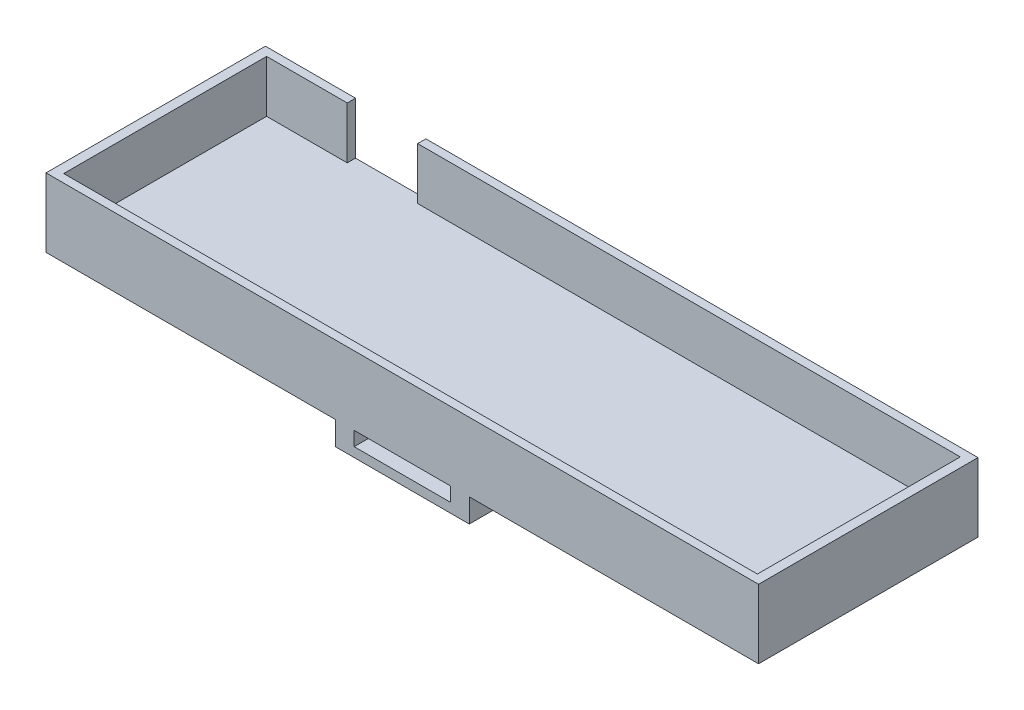
ISO-10303-21;
HEADER;
FILE_DESCRIPTION(('STEP AP214'),'2;1');
FILE_NAME('part.step','',(''),(''),'','','');
FILE_SCHEMA(('AUTOMOTIVE_DESIGN { 1 0 10303 214 1 1 1 1 }'));
ENDSEC;
DATA;
#1=APPLICATION_CONTEXT('core data for automotive mechanical design processes');
#2=APPLICATION_PROTOCOL_DEFINITION('international standard','automotive_design',2000,#1);
#3=PRODUCT_CONTEXT('',#1,'mechanical');
#4=PRODUCT('Part','Part','',(#3));
#5=PRODUCT_RELATED_PRODUCT_CATEGORY('part','',(#4));
#6=PRODUCT_DEFINITION_FORMATION('','',#4);
#7=PRODUCT_DEFINITION_CONTEXT('part definition',#1,'design');
#8=PRODUCT_DEFINITION('design','',#6,#7);
#9=PRODUCT_DEFINITION_SHAPE('','',#8);
#10=(LENGTH_UNIT() NAMED_UNIT(*) SI_UNIT(.MILLI.,.METRE.));
#11=(NAMED_UNIT(*) PLANE_ANGLE_UNIT() SI_UNIT($,.RADIAN.));
#12=(NAMED_UNIT(*) SI_UNIT($,.STERADIAN.) SOLID_ANGLE_UNIT());
#13=UNCERTAINTY_MEASURE_WITH_UNIT(LENGTH_MEASURE(1.E-05),#10,'distance_accuracy_value','');
#14=(GEOMETRIC_REPRESENTATION_CONTEXT(3) GLOBAL_UNCERTAINTY_ASSIGNED_CONTEXT((#13)) GLOBAL_UNIT_ASSIGNED_CONTEXT((#10,
#11,#12)) REPRESENTATION_CONTEXT('',''));
#15=CARTESIAN_POINT('',(0.,0.,0.));
#16=DIRECTION('',(0.,0.,1.));
#17=DIRECTION('',(1.,0.,0.));
#18=AXIS2_PLACEMENT_3D('',#15,#16,#17);
#19=CARTESIAN_POINT('',(-73.5,3.6,-21.5));
#20=DIRECTION('',(0.,0.,-1.));
#21=DIRECTION('',(-1.,0.,0.));
#22=AXIS2_PLACEMENT_3D('',#19,#20,#21);
#23=PLANE('',#22);
#24=DIRECTION('',(-1.,0.,0.));
#25=VECTOR('',#24,1.);
#26=CARTESIAN_POINT('',(-73.5,14.6,-21.5));
#27=LINE('',#26,#25);
#28=CARTESIAN_POINT('',(73.5,14.6,-21.5));
#29=VERTEX_POINT('',#28);
#30=CARTESIAN_POINT('',(-41.5,14.6,-21.5));
#31=VERTEX_POINT('',#30);
#32=EDGE_CURVE('E302',#29,#31,#27,.T.);
#33=ORIENTED_EDGE('',*,*,#32,.T.);
#34=DIRECTION('',(0.,1.,0.));
#35=VECTOR('',#34,1.);
#36=CARTESIAN_POINT('',(-41.5,3.6,-21.5));
#37=LINE('',#36,#35);
#38=CARTESIAN_POINT('',(-41.5,3.6,-21.5));
#39=VERTEX_POINT('',#38);
#40=EDGE_CURVE('E276',#39,#31,#37,.T.);
#41=ORIENTED_EDGE('',*,*,#40,.F.);
#42=DIRECTION('',(-1.,0.,0.));
#43=VECTOR('',#42,1.);
#44=CARTESIAN_POINT('',(-73.5,3.6,-21.5));
#45=LINE('',#44,#43);
#46=CARTESIAN_POINT('',(73.5,3.6,-21.5));
#47=VERTEX_POINT('',#46);
#48=EDGE_CURVE('E290',#47,#39,#45,.T.);
#49=ORIENTED_EDGE('',*,*,#48,.F.);
#50=DIRECTION('',(0.,1.,0.));
#51=VECTOR('',#50,1.);
#52=CARTESIAN_POINT('',(73.5,3.6,-21.5));
#53=LINE('',#52,#51);
#54=EDGE_CURVE('E299',#47,#29,#53,.T.);
#55=ORIENTED_EDGE('',*,*,#54,.T.);
#56=EDGE_LOOP('',(#33,#41,#49,#55));
#57=FACE_BOUND('',#56,.T.);
#58=ADVANCED_FACE('F35',(#57),#23,.F.);
#59=CARTESIAN_POINT('',(0.,0.,0.));
#60=DIRECTION('',(0.,1.,0.));
#61=DIRECTION('',(0.,0.,1.));
#62=AXIS2_PLACEMENT_3D('',#59,#60,#61);
#63=PLANE('',#62);
#64=DIRECTION('',(0.,0.,1.));
#65=VECTOR('',#64,1.);
#66=CARTESIAN_POINT('',(-10.2,0.,-23.25));
#67=LINE('',#66,#65);
#68=CARTESIAN_POINT('',(-10.2,0.,-23.25));
#69=VERTEX_POINT('',#68);
#70=CARTESIAN_POINT('',(-10.2,0.,-10.));
#71=VERTEX_POINT('',#70);
#72=EDGE_CURVE('E312',#69,#71,#67,.T.);
#73=ORIENTED_EDGE('',*,*,#72,.F.);
#74=DIRECTION('',(-1.,0.,0.));
#75=VECTOR('',#74,1.);
#76=CARTESIAN_POINT('',(-75.5,0.,-23.25));
#77=LINE('',#76,#75);
#78=CARTESIAN_POINT('',(10.2,0.,-23.25));
#79=VERTEX_POINT('',#78);
#80=EDGE_CURVE('E426',#79,#69,#77,.T.);
#81=ORIENTED_EDGE('',*,*,#80,.F.);
#82=DIRECTION('',(0.,0.,-1.));
#83=VECTOR('',#82,1.);
#84=CARTESIAN_POINT('',(10.2,0.,-23.25));
#85=LINE('',#84,#83);
#86=CARTESIAN_POINT('',(10.2,0.,-9.99999999999999));
#87=VERTEX_POINT('',#86);
#88=EDGE_CURVE('E346',#87,#79,#85,.T.);
#89=ORIENTED_EDGE('',*,*,#88,.F.);
#90=DIRECTION('',(-1.,0.,0.));
#91=VECTOR('',#90,1.);
#92=CARTESIAN_POINT('',(10.2,0.,-9.99999999999999));
#93=LINE('',#92,#91);
#94=CARTESIAN_POINT('',(14.2,0.,-9.99999999999999));
#95=VERTEX_POINT('',#94);
#96=EDGE_CURVE('E351',#95,#87,#93,.T.);
#97=ORIENTED_EDGE('',*,*,#96,.F.);
#98=DIRECTION('',(0.,0.,1.));
#99=VECTOR('',#98,1.);
#100=CARTESIAN_POINT('',(14.2,0.,-23.25));
#101=LINE('',#100,#99);
#102=CARTESIAN_POINT('',(14.2,0.,-23.25));
#103=VERTEX_POINT('',#102);
#104=EDGE_CURVE('E341',#103,#95,#101,.T.);
#105=ORIENTED_EDGE('',*,*,#104,.F.);
#106=CARTESIAN_POINT('',(75.5,0.,-23.25));
#107=VERTEX_POINT('',#106);
#108=EDGE_CURVE('E422',#107,#103,#77,.T.);
#109=ORIENTED_EDGE('',*,*,#108,.F.);
#110=DIRECTION('',(0.,0.,-1.));
#111=VECTOR('',#110,1.);
#112=CARTESIAN_POINT('',(75.5,0.,-23.25));
#113=LINE('',#112,#111);
#114=CARTESIAN_POINT('',(75.5,0.,23.25));
#115=VERTEX_POINT('',#114);
#116=EDGE_CURVE('E405',#115,#107,#113,.T.);
#117=ORIENTED_EDGE('',*,*,#116,.F.);
#118=DIRECTION('',(1.,0.,0.));
#119=VECTOR('',#118,1.);
#120=CARTESIAN_POINT('',(-75.5,0.,23.25));
#121=LINE('',#120,#119);
#122=CARTESIAN_POINT('',(14.2,0.,23.25));
#123=VERTEX_POINT('',#122);
#124=EDGE_CURVE('E428',#123,#115,#121,.T.);
#125=ORIENTED_EDGE('',*,*,#124,.F.);
#126=DIRECTION('',(0.,0.,1.));
#127=VECTOR('',#126,1.);
#128=CARTESIAN_POINT('',(14.2,0.,23.25));
#129=LINE('',#128,#127);
#130=CARTESIAN_POINT('',(14.2,0.,9.99999999999999));
#131=VERTEX_POINT('',#130);
#132=EDGE_CURVE('E227',#131,#123,#129,.T.);
#133=ORIENTED_EDGE('',*,*,#132,.F.);
#134=DIRECTION('',(1.,0.,0.));
#135=VECTOR('',#134,1.);
#136=CARTESIAN_POINT('',(10.2,0.,9.99999999999999));
#137=LINE('',#136,#135);
#138=CARTESIAN_POINT('',(10.2,0.,9.99999999999999));
#139=VERTEX_POINT('',#138);
#140=EDGE_CURVE('E373',#139,#131,#137,.T.);
#141=ORIENTED_EDGE('',*,*,#140,.F.);
#142=DIRECTION('',(0.,0.,-1.));
#143=VECTOR('',#142,1.);
#144=CARTESIAN_POINT('',(10.2,0.,23.25));
#145=LINE('',#144,#143);
#146=CARTESIAN_POINT('',(10.2,0.,23.25));
#147=VERTEX_POINT('',#146);
#148=EDGE_CURVE('E364',#147,#139,#145,.T.);
#149=ORIENTED_EDGE('',*,*,#148,.F.);
#150=CARTESIAN_POINT('',(-10.2,0.,23.25));
#151=VERTEX_POINT('',#150);
#152=EDGE_CURVE('E430',#151,#147,#121,.T.);
#153=ORIENTED_EDGE('',*,*,#152,.F.);
#154=DIRECTION('',(0.,0.,1.));
#155=VECTOR('',#154,1.);
#156=CARTESIAN_POINT('',(-10.2,0.,23.25));
#157=LINE('',#156,#155);
#158=CARTESIAN_POINT('',(-10.2,0.,9.99999999999999));
#159=VERTEX_POINT('',#158);
#160=EDGE_CURVE('E385',#159,#151,#157,.T.);
#161=ORIENTED_EDGE('',*,*,#160,.F.);
#162=DIRECTION('',(1.,0.,0.));
#163=VECTOR('',#162,1.);
#164=CARTESIAN_POINT('',(-10.2,0.,9.99999999999999));
#165=LINE('',#164,#163);
#166=CARTESIAN_POINT('',(-14.2,0.,9.99999999999999));
#167=VERTEX_POINT('',#166);
#168=EDGE_CURVE('E390',#167,#159,#165,.T.);
#169=ORIENTED_EDGE('',*,*,#168,.F.);
#170=DIRECTION('',(0.,0.,-1.));
#171=VECTOR('',#170,1.);
#172=CARTESIAN_POINT('',(-14.2,0.,23.25));
#173=LINE('',#172,#171);
#174=CARTESIAN_POINT('',(-14.2,0.,23.25));
#175=VERTEX_POINT('',#174);
#176=EDGE_CURVE('E380',#175,#167,#173,.T.);
#177=ORIENTED_EDGE('',*,*,#176,.F.);
#178=CARTESIAN_POINT('',(-75.5,0.,23.25));
#179=VERTEX_POINT('',#178);
#180=EDGE_CURVE('E410',#179,#175,#121,.T.);
#181=ORIENTED_EDGE('',*,*,#180,.F.);
#182=DIRECTION('',(0.,0.,1.));
#183=VECTOR('',#182,1.);
#184=CARTESIAN_POINT('',(-75.5,0.,-23.25));
#185=LINE('',#184,#183);
#186=CARTESIAN_POINT('',(-75.5,0.,-23.25));
#187=VERTEX_POINT('',#186);
#188=EDGE_CURVE('E425',#187,#179,#185,.T.);
#189=ORIENTED_EDGE('',*,*,#188,.F.);
#190=CARTESIAN_POINT('',(-14.2,0.,-23.25));
#191=VERTEX_POINT('',#190);
#192=EDGE_CURVE('E421',#191,#187,#77,.T.);
#193=ORIENTED_EDGE('',*,*,#192,.F.);
#194=DIRECTION('',(0.,0.,-1.));
#195=VECTOR('',#194,1.);
#196=CARTESIAN_POINT('',(-14.2,0.,-23.25));
#197=LINE('',#196,#195);
#198=CARTESIAN_POINT('',(-14.2,0.,-10.));
#199=VERTEX_POINT('',#198);
#200=EDGE_CURVE('E323',#199,#191,#197,.T.);
#201=ORIENTED_EDGE('',*,*,#200,.F.);
#202=DIRECTION('',(-1.,0.,0.));
#203=VECTOR('',#202,1.);
#204=CARTESIAN_POINT('',(-10.2,0.,-10.));
#205=LINE('',#204,#203);
#206=EDGE_CURVE('E329',#71,#199,#205,.T.);
#207=ORIENTED_EDGE('',*,*,#206,.F.);
#208=EDGE_LOOP('',(#73,#81,#89,#97,#105,#109,#117,#125,#133,#141,#149,#153,#161,#169,#177,#181,
#189,#193,#201,#207));
#209=FACE_BOUND('',#208,.T.);
#210=ADVANCED_FACE('F448',(#209),#63,.F.);
#211=CARTESIAN_POINT('',(75.5,14.6,-23.25));
#212=DIRECTION('',(-1.,0.,0.));
#213=DIRECTION('',(0.,0.,1.));
#214=AXIS2_PLACEMENT_3D('',#211,#212,#213);
#215=PLANE('',#214);
#216=ORIENTED_EDGE('',*,*,#116,.T.);
#217=DIRECTION('',(0.,-1.,0.));
#218=VECTOR('',#217,1.);
#219=CARTESIAN_POINT('',(75.5,14.6,-23.25));
#220=LINE('',#219,#218);
#221=CARTESIAN_POINT('',(75.5,14.6,-23.25));
#222=VERTEX_POINT('',#221);
#223=EDGE_CURVE('E11',#222,#107,#220,.T.);
#224=ORIENTED_EDGE('',*,*,#223,.F.);
#225=DIRECTION('',(0.,0.,-1.));
#226=VECTOR('',#225,1.);
#227=CARTESIAN_POINT('',(75.5,14.6,-23.25));
#228=LINE('',#227,#226);
#229=CARTESIAN_POINT('',(75.5,14.6,23.25));
#230=VERTEX_POINT('',#229);
#231=EDGE_CURVE('E406',#230,#222,#228,.T.);
#232=ORIENTED_EDGE('',*,*,#231,.F.);
#233=DIRECTION('',(0.,-1.,0.));
#234=VECTOR('',#233,1.);
#235=CARTESIAN_POINT('',(75.5,14.6,23.25));
#236=LINE('',#235,#234);
#237=EDGE_CURVE('E418',#230,#115,#236,.T.);
#238=ORIENTED_EDGE('',*,*,#237,.T.);
#239=EDGE_LOOP('',(#216,#224,#232,#238));
#240=FACE_BOUND('',#239,.T.);
#241=ADVANCED_FACE('F37',(#240),#215,.F.);
#242=CARTESIAN_POINT('',(-75.5,14.6,-23.25));
#243=DIRECTION('',(0.,0.,1.));
#244=DIRECTION('',(1.,0.,0.));
#245=AXIS2_PLACEMENT_3D('',#242,#243,#244);
#246=PLANE('',#245);
#247=DIRECTION('',(0.,1.,0.));
#248=VECTOR('',#247,1.);
#249=CARTESIAN_POINT('',(14.2,-3.,-23.25));
#250=LINE('',#249,#248);
#251=CARTESIAN_POINT('',(14.2,-5.,-23.25));
#252=VERTEX_POINT('',#251);
#253=EDGE_CURVE('E362',#252,#103,#250,.T.);
#254=ORIENTED_EDGE('',*,*,#253,.F.);
#255=DIRECTION('',(1.,0.,0.));
#256=VECTOR('',#255,1.);
#257=CARTESIAN_POINT('',(14.2,-5.,-23.25));
#258=LINE('',#257,#256);
#259=CARTESIAN_POINT('',(-14.2,-5.,-23.25));
#260=VERTEX_POINT('',#259);
#261=EDGE_CURVE('E248',#260,#252,#258,.T.);
#262=ORIENTED_EDGE('',*,*,#261,.F.);
#263=DIRECTION('',(0.,1.,0.));
#264=VECTOR('',#263,1.);
#265=CARTESIAN_POINT('',(-14.2,-3.,-23.25));
#266=LINE('',#265,#264);
#267=EDGE_CURVE('E334',#260,#191,#266,.T.);
#268=ORIENTED_EDGE('',*,*,#267,.T.);
#269=ORIENTED_EDGE('',*,*,#192,.T.);
#270=DIRECTION('',(0.,-1.,0.));
#271=VECTOR('',#270,1.);
#272=CARTESIAN_POINT('',(-75.5,14.6,-23.25));
#273=LINE('',#272,#271);
#274=CARTESIAN_POINT('',(-75.5,14.6,-23.25));
#275=VERTEX_POINT('',#274);
#276=EDGE_CURVE('E43',#275,#187,#273,.T.);
#277=ORIENTED_EDGE('',*,*,#276,.F.);
#278=DIRECTION('',(-1.,0.,0.));
#279=VECTOR('',#278,1.);
#280=CARTESIAN_POINT('',(-75.5,14.6,-23.25));
#281=LINE('',#280,#279);
#282=CARTESIAN_POINT('',(-56.4143130677962,14.6,-23.25));
#283=VERTEX_POINT('',#282);
#284=EDGE_CURVE('E409',#283,#275,#281,.T.);
#285=ORIENTED_EDGE('',*,*,#284,.F.);
#286=DIRECTION('',(0.,1.,0.));
#287=VECTOR('',#286,1.);
#288=CARTESIAN_POINT('',(-56.4143130677962,3.6,-23.25));
#289=LINE('',#288,#287);
#290=CARTESIAN_POINT('',(-56.4143130677962,3.6,-23.25));
#291=VERTEX_POINT('',#290);
#292=EDGE_CURVE('E281',#291,#283,#289,.T.);
#293=ORIENTED_EDGE('',*,*,#292,.F.);
#294=DIRECTION('',(-1.,0.,0.));
#295=VECTOR('',#294,1.);
#296=CARTESIAN_POINT('',(-41.5,3.6,-23.25));
#297=LINE('',#296,#295);
#298=CARTESIAN_POINT('',(-41.5,3.6,-23.25));
#299=VERTEX_POINT('',#298);
#300=EDGE_CURVE('E269',#299,#291,#297,.T.);
#301=ORIENTED_EDGE('',*,*,#300,.F.);
#302=DIRECTION('',(0.,1.,0.));
#303=VECTOR('',#302,1.);
#304=CARTESIAN_POINT('',(-41.5,3.6,-23.25));
#305=LINE('',#304,#303);
#306=CARTESIAN_POINT('',(-41.5,14.6,-23.25));
#307=VERTEX_POINT('',#306);
#308=EDGE_CURVE('E273',#299,#307,#305,.T.);
#309=ORIENTED_EDGE('',*,*,#308,.T.);
#310=EDGE_CURVE('E411',#222,#307,#281,.T.);
#311=ORIENTED_EDGE('',*,*,#310,.F.);
#312=ORIENTED_EDGE('',*,*,#223,.T.);
#313=ORIENTED_EDGE('',*,*,#108,.T.);
#314=EDGE_LOOP('',(#254,#262,#268,#269,#277,#285,#293,#301,#309,#311,#312,#313));
#315=FACE_BOUND('',#314,.T.);
#316=DIRECTION('',(1.,0.,0.));
#317=VECTOR('',#316,1.);
#318=CARTESIAN_POINT('',(14.2,-3.,-23.25));
#319=LINE('',#318,#317);
#320=CARTESIAN_POINT('',(-10.2,-3.,-23.25));
#321=VERTEX_POINT('',#320);
#322=CARTESIAN_POINT('',(10.2,-3.,-23.25));
#323=VERTEX_POINT('',#322);
#324=EDGE_CURVE('E249',#321,#323,#319,.T.);
#325=ORIENTED_EDGE('',*,*,#324,.T.);
#326=DIRECTION('',(0.,1.,0.));
#327=VECTOR('',#326,1.);
#328=CARTESIAN_POINT('',(10.2,-3.,-23.25));
#329=LINE('',#328,#327);
#330=EDGE_CURVE('E349',#323,#79,#329,.T.);
#331=ORIENTED_EDGE('',*,*,#330,.T.);
#332=ORIENTED_EDGE('',*,*,#80,.T.);
#333=DIRECTION('',(0.,1.,0.));
#334=VECTOR('',#333,1.);
#335=CARTESIAN_POINT('',(-10.2,-3.,-23.25));
#336=LINE('',#335,#334);
#337=EDGE_CURVE('E326',#321,#69,#336,.T.);
#338=ORIENTED_EDGE('',*,*,#337,.F.);
#339=EDGE_LOOP('',(#325,#331,#332,#338));
#340=FACE_BOUND('',#339,.T.);
#341=ADVANCED_FACE('F453',(#315,#340),#246,.F.);
#342=CARTESIAN_POINT('',(-75.5,14.6,-23.25));
#343=DIRECTION('',(1.,0.,0.));
#344=DIRECTION('',(0.,0.,-1.));
#345=AXIS2_PLACEMENT_3D('',#342,#343,#344);
#346=PLANE('',#345);
#347=ORIENTED_EDGE('',*,*,#188,.T.);
#348=DIRECTION('',(0.,-1.,0.));
#349=VECTOR('',#348,1.);
#350=CARTESIAN_POINT('',(-75.5,14.6,23.25));
#351=LINE('',#350,#349);
#352=CARTESIAN_POINT('',(-75.5,14.6,23.25));
#353=VERTEX_POINT('',#352);
#354=EDGE_CURVE('E433',#353,#179,#351,.T.);
#355=ORIENTED_EDGE('',*,*,#354,.F.);
#356=DIRECTION('',(0.,0.,1.));
#357=VECTOR('',#356,1.);
#358=CARTESIAN_POINT('',(-75.5,14.6,-23.25));
#359=LINE('',#358,#357);
#360=EDGE_CURVE('E414',#275,#353,#359,.T.);
#361=ORIENTED_EDGE('',*,*,#360,.F.);
#362=ORIENTED_EDGE('',*,*,#276,.T.);
#363=EDGE_LOOP('',(#347,#355,#361,#362));
#364=FACE_BOUND('',#363,.T.);
#365=ADVANCED_FACE('F440',(#364),#346,.F.);
#366=CARTESIAN_POINT('',(-75.5,14.6,23.25));
#367=DIRECTION('',(0.,0.,-1.));
#368=DIRECTION('',(-1.,0.,0.));
#369=AXIS2_PLACEMENT_3D('',#366,#367,#368);
#370=PLANE('',#369);
#371=DIRECTION('',(0.,1.,0.));
#372=VECTOR('',#371,1.);
#373=CARTESIAN_POINT('',(-14.2,-3.,23.25));
#374=LINE('',#373,#372);
#375=CARTESIAN_POINT('',(-14.2,-5.,23.25));
#376=VERTEX_POINT('',#375);
#377=EDGE_CURVE('E239',#376,#175,#374,.T.);
#378=ORIENTED_EDGE('',*,*,#377,.F.);
#379=DIRECTION('',(-1.,0.,0.));
#380=VECTOR('',#379,1.);
#381=CARTESIAN_POINT('',(14.2,-5.,23.25));
#382=LINE('',#381,#380);
#383=CARTESIAN_POINT('',(14.2,-5.,23.25));
#384=VERTEX_POINT('',#383);
#385=EDGE_CURVE('E234',#384,#376,#382,.T.);
#386=ORIENTED_EDGE('',*,*,#385,.F.);
#387=DIRECTION('',(0.,1.,0.));
#388=VECTOR('',#387,1.);
#389=CARTESIAN_POINT('',(14.2,-3.,23.25));
#390=LINE('',#389,#388);
#391=EDGE_CURVE('E220',#384,#123,#390,.T.);
#392=ORIENTED_EDGE('',*,*,#391,.T.);
#393=ORIENTED_EDGE('',*,*,#124,.T.);
#394=ORIENTED_EDGE('',*,*,#237,.F.);
#395=DIRECTION('',(1.,0.,0.));
#396=VECTOR('',#395,1.);
#397=CARTESIAN_POINT('',(-75.5,14.6,23.25));
#398=LINE('',#397,#396);
#399=EDGE_CURVE('E416',#353,#230,#398,.T.);
#400=ORIENTED_EDGE('',*,*,#399,.F.);
#401=ORIENTED_EDGE('',*,*,#354,.T.);
#402=ORIENTED_EDGE('',*,*,#180,.T.);
#403=EDGE_LOOP('',(#378,#386,#392,#393,#394,#400,#401,#402));
#404=FACE_BOUND('',#403,.T.);
#405=DIRECTION('',(-1.,0.,0.));
#406=VECTOR('',#405,1.);
#407=CARTESIAN_POINT('',(14.2,-3.,23.25));
#408=LINE('',#407,#406);
#409=CARTESIAN_POINT('',(10.2,-3.,23.25));
#410=VERTEX_POINT('',#409);
#411=CARTESIAN_POINT('',(-10.2,-3.,23.25));
#412=VERTEX_POINT('',#411);
#413=EDGE_CURVE('E261',#410,#412,#408,.T.);
#414=ORIENTED_EDGE('',*,*,#413,.T.);
#415=DIRECTION('',(0.,1.,0.));
#416=VECTOR('',#415,1.);
#417=CARTESIAN_POINT('',(-10.2,-3.,23.25));
#418=LINE('',#417,#416);
#419=EDGE_CURVE('E396',#412,#151,#418,.T.);
#420=ORIENTED_EDGE('',*,*,#419,.T.);
#421=ORIENTED_EDGE('',*,*,#152,.T.);
#422=DIRECTION('',(0.,1.,0.));
#423=VECTOR('',#422,1.);
#424=CARTESIAN_POINT('',(10.2,-3.,23.25));
#425=LINE('',#424,#423);
#426=EDGE_CURVE('E231',#410,#147,#425,.T.);
#427=ORIENTED_EDGE('',*,*,#426,.F.);
#428=EDGE_LOOP('',(#414,#420,#421,#427));
#429=FACE_BOUND('',#428,.T.);
#430=ADVANCED_FACE('F235',(#404,#429),#370,.F.);
#431=CARTESIAN_POINT('',(0.,14.6,0.));
#432=DIRECTION('',(0.,1.,0.));
#433=DIRECTION('',(0.,0.,1.));
#434=AXIS2_PLACEMENT_3D('',#431,#432,#433);
#435=PLANE('',#434);
#436=DIRECTION('',(0.,0.,-1.));
#437=VECTOR('',#436,1.);
#438=CARTESIAN_POINT('',(-41.5,14.6,-23.25));
#439=LINE('',#438,#437);
#440=EDGE_CURVE('E257',#31,#307,#439,.T.);
#441=ORIENTED_EDGE('',*,*,#440,.F.);
#442=ORIENTED_EDGE('',*,*,#32,.F.);
#443=DIRECTION('',(0.,0.,-1.));
#444=VECTOR('',#443,1.);
#445=CARTESIAN_POINT('',(73.5,14.6,21.5));
#446=LINE('',#445,#444);
#447=CARTESIAN_POINT('',(73.5,14.6,21.5));
#448=VERTEX_POINT('',#447);
#449=EDGE_CURVE('E58',#448,#29,#446,.T.);
#450=ORIENTED_EDGE('',*,*,#449,.F.);
#451=DIRECTION('',(1.,0.,0.));
#452=VECTOR('',#451,1.);
#453=CARTESIAN_POINT('',(-73.5,14.6,21.5));
#454=LINE('',#453,#452);
#455=CARTESIAN_POINT('',(-73.5,14.6,21.5));
#456=VERTEX_POINT('',#455);
#457=EDGE_CURVE('E289',#456,#448,#454,.T.);
#458=ORIENTED_EDGE('',*,*,#457,.F.);
#459=DIRECTION('',(0.,0.,1.));
#460=VECTOR('',#459,1.);
#461=CARTESIAN_POINT('',(-73.5,14.6,21.5));
#462=LINE('',#461,#460);
#463=CARTESIAN_POINT('',(-73.5,14.6,-21.5));
#464=VERTEX_POINT('',#463);
#465=EDGE_CURVE('E305',#464,#456,#462,.T.);
#466=ORIENTED_EDGE('',*,*,#465,.F.);
#467=CARTESIAN_POINT('',(-56.4143130677962,14.6,-21.5));
#468=VERTEX_POINT('',#467);
#469=EDGE_CURVE('E301',#468,#464,#27,.T.);
#470=ORIENTED_EDGE('',*,*,#469,.F.);
#471=DIRECTION('',(0.,0.,1.));
#472=VECTOR('',#471,1.);
#473=CARTESIAN_POINT('',(-56.4143130677962,14.6,-23.25));
#474=LINE('',#473,#472);
#475=EDGE_CURVE('E270',#283,#468,#474,.T.);
#476=ORIENTED_EDGE('',*,*,#475,.F.);
#477=ORIENTED_EDGE('',*,*,#284,.T.);
#478=ORIENTED_EDGE('',*,*,#360,.T.);
#479=ORIENTED_EDGE('',*,*,#399,.T.);
#480=ORIENTED_EDGE('',*,*,#231,.T.);
#481=ORIENTED_EDGE('',*,*,#310,.T.);
#482=EDGE_LOOP('',(#441,#442,#450,#458,#466,#470,#476,#477,#478,#479,#480,#481));
#483=FACE_BOUND('',#482,.T.);
#484=ADVANCED_FACE('F537',(#483),#435,.T.);
#485=CARTESIAN_POINT('',(-14.2,-3.,23.25));
#486=DIRECTION('',(1.,0.,0.));
#487=DIRECTION('',(0.,0.,-1.));
#488=AXIS2_PLACEMENT_3D('',#485,#486,#487);
#489=PLANE('',#488);
#490=ORIENTED_EDGE('',*,*,#176,.T.);
#491=DIRECTION('',(0.,1.,0.));
#492=VECTOR('',#491,1.);
#493=CARTESIAN_POINT('',(-14.2,-3.,9.99999999999999));
#494=LINE('',#493,#492);
#495=CARTESIAN_POINT('',(-14.2,-3.,9.99999999999998));
#496=VERTEX_POINT('',#495);
#497=EDGE_CURVE('E402',#496,#167,#494,.T.);
#498=ORIENTED_EDGE('',*,*,#497,.F.);
#499=DIRECTION('',(0.,0.,-1.));
#500=VECTOR('',#499,1.);
#501=CARTESIAN_POINT('',(-14.2,-3.,-23.25));
#502=LINE('',#501,#500);
#503=CARTESIAN_POINT('',(-14.2,-3.,-10.));
#504=VERTEX_POINT('',#503);
#505=EDGE_CURVE('E252',#496,#504,#502,.T.);
#506=ORIENTED_EDGE('',*,*,#505,.T.);
#507=DIRECTION('',(0.,1.,0.));
#508=VECTOR('',#507,1.);
#509=CARTESIAN_POINT('',(-14.2,-3.,-10.));
#510=LINE('',#509,#508);
#511=EDGE_CURVE('E336',#504,#199,#510,.T.);
#512=ORIENTED_EDGE('',*,*,#511,.T.);
#513=ORIENTED_EDGE('',*,*,#200,.T.);
#514=ORIENTED_EDGE('',*,*,#267,.F.);
#515=DIRECTION('',(0.,0.,-1.));
#516=VECTOR('',#515,1.);
#517=CARTESIAN_POINT('',(-14.2,-5.,-23.25));
#518=LINE('',#517,#516);
#519=EDGE_CURVE('E243',#376,#260,#518,.T.);
#520=ORIENTED_EDGE('',*,*,#519,.F.);
#521=ORIENTED_EDGE('',*,*,#377,.T.);
#522=EDGE_LOOP('',(#490,#498,#506,#512,#513,#514,#520,#521));
#523=FACE_BOUND('',#522,.T.);
#524=ADVANCED_FACE('F452',(#523),#489,.F.);
#525=CARTESIAN_POINT('',(-10.2,-3.,9.99999999999999));
#526=DIRECTION('',(0.,0.,1.));
#527=DIRECTION('',(1.,0.,0.));
#528=AXIS2_PLACEMENT_3D('',#525,#526,#527);
#529=PLANE('',#528);
#530=ORIENTED_EDGE('',*,*,#168,.T.);
#531=DIRECTION('',(0.,1.,0.));
#532=VECTOR('',#531,1.);
#533=CARTESIAN_POINT('',(-10.2,-3.,9.99999999999999));
#534=LINE('',#533,#532);
#535=CARTESIAN_POINT('',(-10.2,-3.,9.99999999999999));
#536=VERTEX_POINT('',#535);
#537=EDGE_CURVE('E399',#536,#159,#534,.T.);
#538=ORIENTED_EDGE('',*,*,#537,.F.);
#539=DIRECTION('',(1.,0.,0.));
#540=VECTOR('',#539,1.);
#541=CARTESIAN_POINT('',(-10.2,-3.,9.99999999999999));
#542=LINE('',#541,#540);
#543=EDGE_CURVE('E381',#496,#536,#542,.T.);
#544=ORIENTED_EDGE('',*,*,#543,.F.);
#545=ORIENTED_EDGE('',*,*,#497,.T.);
#546=EDGE_LOOP('',(#530,#538,#544,#545));
#547=FACE_BOUND('',#546,.T.);
#548=ADVANCED_FACE('F483',(#547),#529,.F.);
#549=CARTESIAN_POINT('',(-10.2,-3.,23.25));
#550=DIRECTION('',(-1.,0.,0.));
#551=DIRECTION('',(0.,0.,1.));
#552=AXIS2_PLACEMENT_3D('',#549,#550,#551);
#553=PLANE('',#552);
#554=ORIENTED_EDGE('',*,*,#160,.T.);
#555=ORIENTED_EDGE('',*,*,#419,.F.);
#556=DIRECTION('',(0.,0.,1.));
#557=VECTOR('',#556,1.);
#558=CARTESIAN_POINT('',(-10.2,-3.,23.25));
#559=LINE('',#558,#557);
#560=EDGE_CURVE('E384',#536,#412,#559,.T.);
#561=ORIENTED_EDGE('',*,*,#560,.F.);
#562=ORIENTED_EDGE('',*,*,#537,.T.);
#563=EDGE_LOOP('',(#554,#555,#561,#562));
#564=FACE_BOUND('',#563,.T.);
#565=ADVANCED_FACE('F479',(#564),#553,.F.);
#566=CARTESIAN_POINT('',(10.2,-3.,23.25));
#567=DIRECTION('',(1.,0.,0.));
#568=DIRECTION('',(0.,0.,-1.));
#569=AXIS2_PLACEMENT_3D('',#566,#567,#568);
#570=PLANE('',#569);
#571=ORIENTED_EDGE('',*,*,#148,.T.);
#572=DIRECTION('',(0.,1.,0.));
#573=VECTOR('',#572,1.);
#574=CARTESIAN_POINT('',(10.2,-3.,9.99999999999999));
#575=LINE('',#574,#573);
#576=CARTESIAN_POINT('',(10.2,-3.,9.99999999999999));
#577=VERTEX_POINT('',#576);
#578=EDGE_CURVE('E378',#577,#139,#575,.T.);
#579=ORIENTED_EDGE('',*,*,#578,.F.);
#580=DIRECTION('',(0.,0.,-1.));
#581=VECTOR('',#580,1.);
#582=CARTESIAN_POINT('',(10.2,-3.,23.25));
#583=LINE('',#582,#581);
#584=EDGE_CURVE('E365',#410,#577,#583,.T.);
#585=ORIENTED_EDGE('',*,*,#584,.F.);
#586=ORIENTED_EDGE('',*,*,#426,.T.);
#587=EDGE_LOOP('',(#571,#579,#585,#586));
#588=FACE_BOUND('',#587,.T.);
#589=ADVANCED_FACE('F575',(#588),#570,.F.);
#590=CARTESIAN_POINT('',(10.2,-3.,9.99999999999999));
#591=DIRECTION('',(0.,0.,1.));
#592=DIRECTION('',(1.,0.,0.));
#593=AXIS2_PLACEMENT_3D('',#590,#591,#592);
#594=PLANE('',#593);
#595=ORIENTED_EDGE('',*,*,#140,.T.);
#596=DIRECTION('',(0.,1.,0.));
#597=VECTOR('',#596,1.);
#598=CARTESIAN_POINT('',(14.2,-3.,9.99999999999999));
#599=LINE('',#598,#597);
#600=CARTESIAN_POINT('',(14.2,-3.,9.99999999999999));
#601=VERTEX_POINT('',#600);
#602=EDGE_CURVE('E230',#601,#131,#599,.T.);
#603=ORIENTED_EDGE('',*,*,#602,.F.);
#604=DIRECTION('',(1.,0.,0.));
#605=VECTOR('',#604,1.);
#606=CARTESIAN_POINT('',(10.2,-3.,9.99999999999999));
#607=LINE('',#606,#605);
#608=EDGE_CURVE('E368',#577,#601,#607,.T.);
#609=ORIENTED_EDGE('',*,*,#608,.F.);
#610=ORIENTED_EDGE('',*,*,#578,.T.);
#611=EDGE_LOOP('',(#595,#603,#609,#610));
#612=FACE_BOUND('',#611,.T.);
#613=ADVANCED_FACE('F572',(#612),#594,.F.);
#614=CARTESIAN_POINT('',(14.2,-3.,23.25));
#615=DIRECTION('',(-1.,0.,0.));
#616=DIRECTION('',(0.,0.,1.));
#617=AXIS2_PLACEMENT_3D('',#614,#615,#616);
#618=PLANE('',#617);
#619=ORIENTED_EDGE('',*,*,#132,.T.);
#620=ORIENTED_EDGE('',*,*,#391,.F.);
#621=DIRECTION('',(0.,0.,1.));
#622=VECTOR('',#621,1.);
#623=CARTESIAN_POINT('',(14.2,-5.,-23.25));
#624=LINE('',#623,#622);
#625=EDGE_CURVE('E224',#252,#384,#624,.T.);
#626=ORIENTED_EDGE('',*,*,#625,.F.);
#627=ORIENTED_EDGE('',*,*,#253,.T.);
#628=ORIENTED_EDGE('',*,*,#104,.T.);
#629=DIRECTION('',(0.,1.,0.));
#630=VECTOR('',#629,1.);
#631=CARTESIAN_POINT('',(14.2,-3.,-9.99999999999999));
#632=LINE('',#631,#630);
#633=CARTESIAN_POINT('',(14.2,-3.,-9.99999999999999));
#634=VERTEX_POINT('',#633);
#635=EDGE_CURVE('E359',#634,#95,#632,.T.);
#636=ORIENTED_EDGE('',*,*,#635,.F.);
#637=DIRECTION('',(0.,0.,1.));
#638=VECTOR('',#637,1.);
#639=CARTESIAN_POINT('',(14.2,-3.,-23.25));
#640=LINE('',#639,#638);
#641=EDGE_CURVE('E258',#634,#601,#640,.T.);
#642=ORIENTED_EDGE('',*,*,#641,.T.);
#643=ORIENTED_EDGE('',*,*,#602,.T.);
#644=EDGE_LOOP('',(#619,#620,#626,#627,#628,#636,#642,#643));
#645=FACE_BOUND('',#644,.T.);
#646=ADVANCED_FACE('F222',(#645),#618,.F.);
#647=CARTESIAN_POINT('',(10.2,-3.,-9.99999999999999));
#648=DIRECTION('',(0.,0.,-1.));
#649=DIRECTION('',(-1.,0.,0.));
#650=AXIS2_PLACEMENT_3D('',#647,#648,#649);
#651=PLANE('',#650);
#652=ORIENTED_EDGE('',*,*,#96,.T.);
#653=DIRECTION('',(0.,1.,0.));
#654=VECTOR('',#653,1.);
#655=CARTESIAN_POINT('',(10.2,-3.,-9.99999999999999));
#656=LINE('',#655,#654);
#657=CARTESIAN_POINT('',(10.2,-3.,-9.99999999999999));
#658=VERTEX_POINT('',#657);
#659=EDGE_CURVE('E356',#658,#87,#656,.T.);
#660=ORIENTED_EDGE('',*,*,#659,.F.);
#661=DIRECTION('',(-1.,0.,0.));
#662=VECTOR('',#661,1.);
#663=CARTESIAN_POINT('',(10.2,-3.,-9.99999999999999));
#664=LINE('',#663,#662);
#665=EDGE_CURVE('E342',#634,#658,#664,.T.);
#666=ORIENTED_EDGE('',*,*,#665,.F.);
#667=ORIENTED_EDGE('',*,*,#635,.T.);
#668=EDGE_LOOP('',(#652,#660,#666,#667));
#669=FACE_BOUND('',#668,.T.);
#670=ADVANCED_FACE('F461',(#669),#651,.F.);
#671=CARTESIAN_POINT('',(10.2,-3.,-23.25));
#672=DIRECTION('',(1.,0.,0.));
#673=DIRECTION('',(0.,0.,-1.));
#674=AXIS2_PLACEMENT_3D('',#671,#672,#673);
#675=PLANE('',#674);
#676=ORIENTED_EDGE('',*,*,#88,.T.);
#677=ORIENTED_EDGE('',*,*,#330,.F.);
#678=DIRECTION('',(0.,0.,-1.));
#679=VECTOR('',#678,1.);
#680=CARTESIAN_POINT('',(10.2,-3.,-23.25));
#681=LINE('',#680,#679);
#682=EDGE_CURVE('E345',#658,#323,#681,.T.);
#683=ORIENTED_EDGE('',*,*,#682,.F.);
#684=ORIENTED_EDGE('',*,*,#659,.T.);
#685=EDGE_LOOP('',(#676,#677,#683,#684));
#686=FACE_BOUND('',#685,.T.);
#687=ADVANCED_FACE('F465',(#686),#675,.F.);
#688=CARTESIAN_POINT('',(-10.2,-3.,-23.25));
#689=DIRECTION('',(-1.,0.,0.));
#690=DIRECTION('',(0.,0.,1.));
#691=AXIS2_PLACEMENT_3D('',#688,#689,#690);
#692=PLANE('',#691);
#693=ORIENTED_EDGE('',*,*,#72,.T.);
#694=DIRECTION('',(0.,1.,0.));
#695=VECTOR('',#694,1.);
#696=CARTESIAN_POINT('',(-10.2,-3.,-10.));
#697=LINE('',#696,#695);
#698=CARTESIAN_POINT('',(-10.2,-3.,-10.));
#699=VERTEX_POINT('',#698);
#700=EDGE_CURVE('E339',#699,#71,#697,.T.);
#701=ORIENTED_EDGE('',*,*,#700,.F.);
#702=DIRECTION('',(0.,0.,1.));
#703=VECTOR('',#702,1.);
#704=CARTESIAN_POINT('',(-10.2,-3.,-23.25));
#705=LINE('',#704,#703);
#706=EDGE_CURVE('E319',#321,#699,#705,.T.);
#707=ORIENTED_EDGE('',*,*,#706,.F.);
#708=ORIENTED_EDGE('',*,*,#337,.T.);
#709=EDGE_LOOP('',(#693,#701,#707,#708));
#710=FACE_BOUND('',#709,.T.);
#711=ADVANCED_FACE('F488',(#710),#692,.F.);
#712=CARTESIAN_POINT('',(-10.2,-3.,-10.));
#713=DIRECTION('',(0.,0.,-1.));
#714=DIRECTION('',(-1.,0.,0.));
#715=AXIS2_PLACEMENT_3D('',#712,#713,#714);
#716=PLANE('',#715);
#717=ORIENTED_EDGE('',*,*,#206,.T.);
#718=ORIENTED_EDGE('',*,*,#511,.F.);
#719=DIRECTION('',(-1.,0.,0.));
#720=VECTOR('',#719,1.);
#721=CARTESIAN_POINT('',(-10.2,-3.,-10.));
#722=LINE('',#721,#720);
#723=EDGE_CURVE('E322',#699,#504,#722,.T.);
#724=ORIENTED_EDGE('',*,*,#723,.F.);
#725=ORIENTED_EDGE('',*,*,#700,.T.);
#726=EDGE_LOOP('',(#717,#718,#724,#725));
#727=FACE_BOUND('',#726,.T.);
#728=ADVANCED_FACE('F486',(#727),#716,.F.);
#729=CARTESIAN_POINT('',(73.5,3.6,21.5));
#730=DIRECTION('',(1.,0.,0.));
#731=DIRECTION('',(0.,0.,-1.));
#732=AXIS2_PLACEMENT_3D('',#729,#730,#731);
#733=PLANE('',#732);
#734=ORIENTED_EDGE('',*,*,#449,.T.);
#735=ORIENTED_EDGE('',*,*,#54,.F.);
#736=DIRECTION('',(0.,0.,-1.));
#737=VECTOR('',#736,1.);
#738=CARTESIAN_POINT('',(73.5,3.6,21.5));
#739=LINE('',#738,#737);
#740=CARTESIAN_POINT('',(73.5,3.6,21.5));
#741=VERTEX_POINT('',#740);
#742=EDGE_CURVE('E285',#741,#47,#739,.T.);
#743=ORIENTED_EDGE('',*,*,#742,.F.);
#744=DIRECTION('',(0.,1.,0.));
#745=VECTOR('',#744,1.);
#746=CARTESIAN_POINT('',(73.5,3.6,21.5));
#747=LINE('',#746,#745);
#748=EDGE_CURVE('E310',#741,#448,#747,.T.);
#749=ORIENTED_EDGE('',*,*,#748,.T.);
#750=EDGE_LOOP('',(#734,#735,#743,#749));
#751=FACE_BOUND('',#750,.T.);
#752=ADVANCED_FACE('F529',(#751),#733,.F.);
#753=CARTESIAN_POINT('',(-73.5,3.6,21.5));
#754=DIRECTION('',(0.,0.,1.));
#755=DIRECTION('',(1.,0.,0.));
#756=AXIS2_PLACEMENT_3D('',#753,#754,#755);
#757=PLANE('',#756);
#758=ORIENTED_EDGE('',*,*,#457,.T.);
#759=ORIENTED_EDGE('',*,*,#748,.F.);
#760=DIRECTION('',(1.,0.,0.));
#761=VECTOR('',#760,1.);
#762=CARTESIAN_POINT('',(-73.5,3.6,21.5));
#763=LINE('',#762,#761);
#764=CARTESIAN_POINT('',(-73.5,3.6,21.5));
#765=VERTEX_POINT('',#764);
#766=EDGE_CURVE('E296',#765,#741,#763,.T.);
#767=ORIENTED_EDGE('',*,*,#766,.F.);
#768=DIRECTION('',(0.,1.,0.));
#769=VECTOR('',#768,1.);
#770=CARTESIAN_POINT('',(-73.5,3.6,21.5));
#771=LINE('',#770,#769);
#772=EDGE_CURVE('E313',#765,#456,#771,.T.);
#773=ORIENTED_EDGE('',*,*,#772,.T.);
#774=EDGE_LOOP('',(#758,#759,#767,#773));
#775=FACE_BOUND('',#774,.T.);
#776=ADVANCED_FACE('F519',(#775),#757,.F.);
#777=CARTESIAN_POINT('',(-73.5,3.6,21.5));
#778=DIRECTION('',(-1.,0.,0.));
#779=DIRECTION('',(0.,0.,1.));
#780=AXIS2_PLACEMENT_3D('',#777,#778,#779);
#781=PLANE('',#780);
#782=ORIENTED_EDGE('',*,*,#465,.T.);
#783=ORIENTED_EDGE('',*,*,#772,.F.);
#784=DIRECTION('',(0.,0.,1.));
#785=VECTOR('',#784,1.);
#786=CARTESIAN_POINT('',(-73.5,3.6,21.5));
#787=LINE('',#786,#785);
#788=CARTESIAN_POINT('',(-73.5,3.6,-21.5));
#789=VERTEX_POINT('',#788);
#790=EDGE_CURVE('E293',#789,#765,#787,.T.);
#791=ORIENTED_EDGE('',*,*,#790,.F.);
#792=DIRECTION('',(0.,1.,0.));
#793=VECTOR('',#792,1.);
#794=CARTESIAN_POINT('',(-73.5,3.6,-21.5));
#795=LINE('',#794,#793);
#796=EDGE_CURVE('E315',#789,#464,#795,.T.);
#797=ORIENTED_EDGE('',*,*,#796,.T.);
#798=EDGE_LOOP('',(#782,#783,#791,#797));
#799=FACE_BOUND('',#798,.T.);
#800=ADVANCED_FACE('F511',(#799),#781,.F.);
#801=CARTESIAN_POINT('',(-56.4143130677962,3.6,-21.5));
#802=VERTEX_POINT('',#801);
#803=EDGE_CURVE('E288',#802,#789,#45,.T.);
#804=ORIENTED_EDGE('',*,*,#803,.F.);
#805=DIRECTION('',(0.,1.,0.));
#806=VECTOR('',#805,1.);
#807=CARTESIAN_POINT('',(-56.4143130677962,3.6,-21.5));
#808=LINE('',#807,#806);
#809=EDGE_CURVE('E278',#802,#468,#808,.T.);
#810=ORIENTED_EDGE('',*,*,#809,.T.);
#811=ORIENTED_EDGE('',*,*,#469,.T.);
#812=ORIENTED_EDGE('',*,*,#796,.F.);
#813=EDGE_LOOP('',(#804,#810,#811,#812));
#814=FACE_BOUND('',#813,.T.);
#815=ADVANCED_FACE('F502',(#814),#23,.F.);
#816=CARTESIAN_POINT('',(0.,3.6,0.));
#817=DIRECTION('',(0.,-1.,0.));
#818=DIRECTION('',(0.,0.,-1.));
#819=AXIS2_PLACEMENT_3D('',#816,#817,#818);
#820=PLANE('',#819);
#821=ORIENTED_EDGE('',*,*,#742,.T.);
#822=ORIENTED_EDGE('',*,*,#48,.T.);
#823=DIRECTION('',(0.,0.,-1.));
#824=VECTOR('',#823,1.);
#825=CARTESIAN_POINT('',(-41.5,3.6,-23.25));
#826=LINE('',#825,#824);
#827=EDGE_CURVE('E266',#39,#299,#826,.T.);
#828=ORIENTED_EDGE('',*,*,#827,.T.);
#829=ORIENTED_EDGE('',*,*,#300,.T.);
#830=DIRECTION('',(0.,0.,1.));
#831=VECTOR('',#830,1.);
#832=CARTESIAN_POINT('',(-56.4143130677962,3.6,-23.25));
#833=LINE('',#832,#831);
#834=EDGE_CURVE('E50',#291,#802,#833,.T.);
#835=ORIENTED_EDGE('',*,*,#834,.T.);
#836=ORIENTED_EDGE('',*,*,#803,.T.);
#837=ORIENTED_EDGE('',*,*,#790,.T.);
#838=ORIENTED_EDGE('',*,*,#766,.T.);
#839=EDGE_LOOP('',(#821,#822,#828,#829,#835,#836,#837,#838));
#840=FACE_BOUND('',#839,.T.);
#841=ADVANCED_FACE('F510',(#840),#820,.F.);
#842=CARTESIAN_POINT('',(-41.5,3.6,-23.25));
#843=DIRECTION('',(1.,0.,0.));
#844=DIRECTION('',(0.,0.,-1.));
#845=AXIS2_PLACEMENT_3D('',#842,#843,#844);
#846=PLANE('',#845);
#847=ORIENTED_EDGE('',*,*,#440,.T.);
#848=ORIENTED_EDGE('',*,*,#308,.F.);
#849=ORIENTED_EDGE('',*,*,#827,.F.);
#850=ORIENTED_EDGE('',*,*,#40,.T.);
#851=EDGE_LOOP('',(#847,#848,#849,#850));
#852=FACE_BOUND('',#851,.T.);
#853=ADVANCED_FACE('F517',(#852),#846,.F.);
#854=CARTESIAN_POINT('',(-56.4143130677962,3.6,-23.25));
#855=DIRECTION('',(-1.,0.,0.));
#856=DIRECTION('',(0.,0.,1.));
#857=AXIS2_PLACEMENT_3D('',#854,#855,#856);
#858=PLANE('',#857);
#859=ORIENTED_EDGE('',*,*,#475,.T.);
#860=ORIENTED_EDGE('',*,*,#809,.F.);
#861=ORIENTED_EDGE('',*,*,#834,.F.);
#862=ORIENTED_EDGE('',*,*,#292,.T.);
#863=EDGE_LOOP('',(#859,#860,#861,#862));
#864=FACE_BOUND('',#863,.T.);
#865=ADVANCED_FACE('F543',(#864),#858,.F.);
#866=CARTESIAN_POINT('',(0.,-3.,0.));
#867=DIRECTION('',(0.,-1.,0.));
#868=DIRECTION('',(0.,0.,-1.));
#869=AXIS2_PLACEMENT_3D('',#866,#867,#868);
#870=PLANE('',#869);
#871=ORIENTED_EDGE('',*,*,#505,.F.);
#872=ORIENTED_EDGE('',*,*,#543,.T.);
#873=ORIENTED_EDGE('',*,*,#560,.T.);
#874=ORIENTED_EDGE('',*,*,#413,.F.);
#875=ORIENTED_EDGE('',*,*,#584,.T.);
#876=ORIENTED_EDGE('',*,*,#608,.T.);
#877=ORIENTED_EDGE('',*,*,#641,.F.);
#878=ORIENTED_EDGE('',*,*,#665,.T.);
#879=ORIENTED_EDGE('',*,*,#682,.T.);
#880=ORIENTED_EDGE('',*,*,#324,.F.);
#881=ORIENTED_EDGE('',*,*,#706,.T.);
#882=ORIENTED_EDGE('',*,*,#723,.T.);
#883=EDGE_LOOP('',(#871,#872,#873,#874,#875,#876,#877,#878,#879,#880,#881,#882));
#884=FACE_BOUND('',#883,.T.);
#885=ADVANCED_FACE('F470',(#884),#870,.F.);
#886=CARTESIAN_POINT('',(0.,-5.,0.));
#887=DIRECTION('',(0.,-1.,0.));
#888=DIRECTION('',(0.,0.,-1.));
#889=AXIS2_PLACEMENT_3D('',#886,#887,#888);
#890=PLANE('',#889);
#891=ORIENTED_EDGE('',*,*,#625,.T.);
#892=ORIENTED_EDGE('',*,*,#385,.T.);
#893=ORIENTED_EDGE('',*,*,#519,.T.);
#894=ORIENTED_EDGE('',*,*,#261,.T.);
#895=EDGE_LOOP('',(#891,#892,#893,#894));
#896=FACE_BOUND('',#895,.T.);
#897=ADVANCED_FACE('F246',(#896),#890,.T.);
#898=CLOSED_SHELL('',(#58,#210,#241,#341,#365,#430,#484,#524,#548,#565,#589,#613,#646,#670,#687,
#711,#728,#752,#776,#800,#815,#841,#853,#865,#885,#897));
#899=MANIFOLD_SOLID_BREP('B2',#898);
#900=ADVANCED_BREP_SHAPE_REPRESENTATION('',(#18,#899),#14);
#901=SHAPE_DEFINITION_REPRESENTATION(#9,#900);
ENDSEC;
END-ISO-10303-21;
